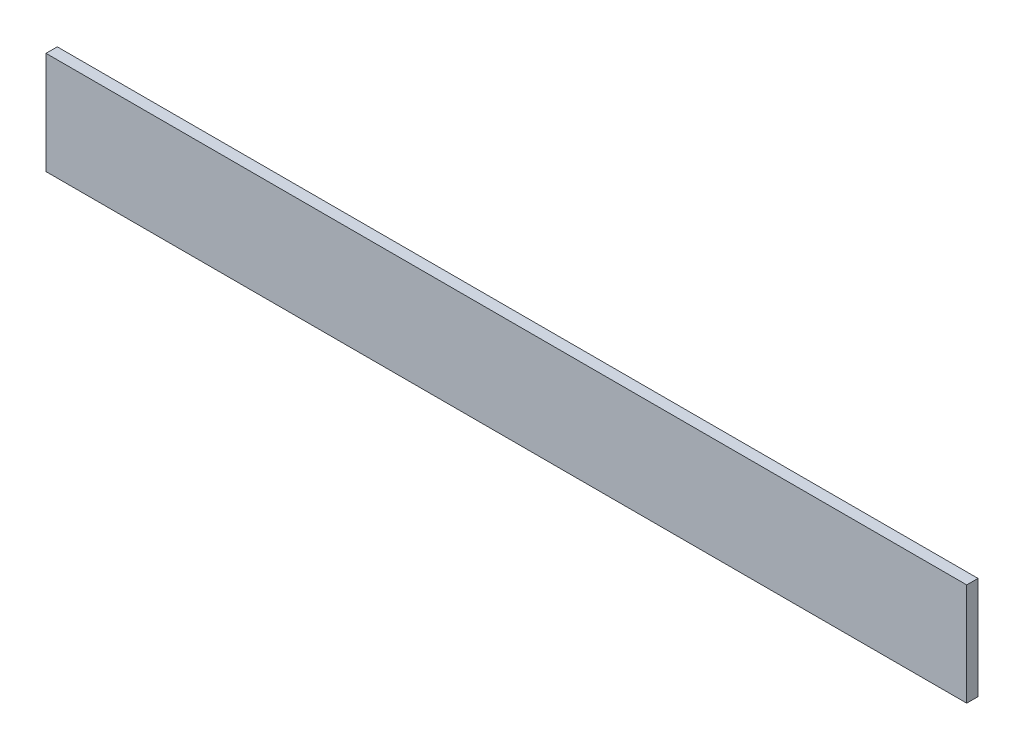
ISO-10303-21;
HEADER;
FILE_DESCRIPTION(('STEP AP214'),'2;1');
FILE_NAME('part.step','',(''),(''),'','','');
FILE_SCHEMA(('AUTOMOTIVE_DESIGN { 1 0 10303 214 1 1 1 1 }'));
ENDSEC;
DATA;
#1=APPLICATION_CONTEXT('core data for automotive mechanical design processes');
#2=APPLICATION_PROTOCOL_DEFINITION('international standard','automotive_design',2000,#1);
#3=PRODUCT_CONTEXT('',#1,'mechanical');
#4=PRODUCT('Part','Part','',(#3));
#5=PRODUCT_RELATED_PRODUCT_CATEGORY('part','',(#4));
#6=PRODUCT_DEFINITION_FORMATION('','',#4);
#7=PRODUCT_DEFINITION_CONTEXT('part definition',#1,'design');
#8=PRODUCT_DEFINITION('design','',#6,#7);
#9=PRODUCT_DEFINITION_SHAPE('','',#8);
#10=(LENGTH_UNIT() NAMED_UNIT(*) SI_UNIT(.MILLI.,.METRE.));
#11=(NAMED_UNIT(*) PLANE_ANGLE_UNIT() SI_UNIT($,.RADIAN.));
#12=(NAMED_UNIT(*) SI_UNIT($,.STERADIAN.) SOLID_ANGLE_UNIT());
#13=UNCERTAINTY_MEASURE_WITH_UNIT(LENGTH_MEASURE(1.E-05),#10,'distance_accuracy_value','');
#14=(GEOMETRIC_REPRESENTATION_CONTEXT(3) GLOBAL_UNCERTAINTY_ASSIGNED_CONTEXT((#13)) GLOBAL_UNIT_ASSIGNED_CONTEXT((#10,
#11,#12)) REPRESENTATION_CONTEXT('',''));
#15=CARTESIAN_POINT('',(0.,0.,0.));
#16=DIRECTION('',(0.,0.,1.));
#17=DIRECTION('',(1.,0.,0.));
#18=AXIS2_PLACEMENT_3D('',#15,#16,#17);
#19=CARTESIAN_POINT('',(0.,0.,1.016));
#20=DIRECTION('',(0.,1.,0.));
#21=DIRECTION('',(0.,0.,1.));
#22=AXIS2_PLACEMENT_3D('',#19,#20,#21);
#23=PLANE('',#22);
#24=DIRECTION('',(1.,0.,0.));
#25=VECTOR('',#24,1.);
#26=CARTESIAN_POINT('',(0.,0.,0.));
#27=LINE('',#26,#25);
#28=CARTESIAN_POINT('',(0.,0.,0.));
#29=VERTEX_POINT('',#28);
#30=CARTESIAN_POINT('',(82.95,0.,0.));
#31=VERTEX_POINT('',#30);
#32=EDGE_CURVE('E96',#29,#31,#27,.T.);
#33=ORIENTED_EDGE('',*,*,#32,.T.);
#34=DIRECTION('',(0.,0.,-1.));
#35=VECTOR('',#34,1.);
#36=CARTESIAN_POINT('',(82.95,0.,1.016));
#37=LINE('',#36,#35);
#38=CARTESIAN_POINT('',(82.95,0.,1.016));
#39=VERTEX_POINT('',#38);
#40=EDGE_CURVE('E11',#39,#31,#37,.T.);
#41=ORIENTED_EDGE('',*,*,#40,.F.);
#42=DIRECTION('',(1.,0.,0.));
#43=VECTOR('',#42,1.);
#44=CARTESIAN_POINT('',(0.,0.,1.016));
#45=LINE('',#44,#43);
#46=CARTESIAN_POINT('',(0.,0.,1.016));
#47=VERTEX_POINT('',#46);
#48=EDGE_CURVE('E84',#47,#39,#45,.T.);
#49=ORIENTED_EDGE('',*,*,#48,.F.);
#50=DIRECTION('',(0.,0.,-1.));
#51=VECTOR('',#50,1.);
#52=CARTESIAN_POINT('',(0.,0.,1.016));
#53=LINE('',#52,#51);
#54=EDGE_CURVE('E92',#47,#29,#53,.T.);
#55=ORIENTED_EDGE('',*,*,#54,.T.);
#56=EDGE_LOOP('',(#33,#41,#49,#55));
#57=FACE_BOUND('',#56,.T.);
#58=ADVANCED_FACE('F33',(#57),#23,.F.);
#59=CARTESIAN_POINT('',(82.95,0.,1.016));
#60=DIRECTION('',(-1.,0.,0.));
#61=DIRECTION('',(0.,-1.,0.));
#62=AXIS2_PLACEMENT_3D('',#59,#60,#61);
#63=PLANE('',#62);
#64=DIRECTION('',(0.,1.,0.));
#65=VECTOR('',#64,1.);
#66=CARTESIAN_POINT('',(82.95,0.,0.));
#67=LINE('',#66,#65);
#68=CARTESIAN_POINT('',(82.95,9.23,0.));
#69=VERTEX_POINT('',#68);
#70=EDGE_CURVE('E88',#31,#69,#67,.T.);
#71=ORIENTED_EDGE('',*,*,#70,.T.);
#72=DIRECTION('',(0.,0.,-1.));
#73=VECTOR('',#72,1.);
#74=CARTESIAN_POINT('',(82.95,9.23,1.016));
#75=LINE('',#74,#73);
#76=CARTESIAN_POINT('',(82.95,9.23,1.016));
#77=VERTEX_POINT('',#76);
#78=EDGE_CURVE('E41',#77,#69,#75,.T.);
#79=ORIENTED_EDGE('',*,*,#78,.F.);
#80=DIRECTION('',(0.,1.,0.));
#81=VECTOR('',#80,1.);
#82=CARTESIAN_POINT('',(82.95,0.,1.016));
#83=LINE('',#82,#81);
#84=EDGE_CURVE('E79',#39,#77,#83,.T.);
#85=ORIENTED_EDGE('',*,*,#84,.F.);
#86=ORIENTED_EDGE('',*,*,#40,.T.);
#87=EDGE_LOOP('',(#71,#79,#85,#86));
#88=FACE_BOUND('',#87,.T.);
#89=ADVANCED_FACE('F87',(#88),#63,.F.);
#90=CARTESIAN_POINT('',(0.,9.23,1.016));
#91=DIRECTION('',(0.,-1.,0.));
#92=DIRECTION('',(0.,0.,-1.));
#93=AXIS2_PLACEMENT_3D('',#90,#91,#92);
#94=PLANE('',#93);
#95=DIRECTION('',(-1.,0.,0.));
#96=VECTOR('',#95,1.);
#97=CARTESIAN_POINT('',(0.,9.23,0.));
#98=LINE('',#97,#96);
#99=CARTESIAN_POINT('',(0.,9.23,0.));
#100=VERTEX_POINT('',#99);
#101=EDGE_CURVE('E66',#69,#100,#98,.T.);
#102=ORIENTED_EDGE('',*,*,#101,.T.);
#103=DIRECTION('',(0.,0.,-1.));
#104=VECTOR('',#103,1.);
#105=CARTESIAN_POINT('',(0.,9.23,1.016));
#106=LINE('',#105,#104);
#107=CARTESIAN_POINT('',(0.,9.23,1.016));
#108=VERTEX_POINT('',#107);
#109=EDGE_CURVE('E89',#108,#100,#106,.T.);
#110=ORIENTED_EDGE('',*,*,#109,.F.);
#111=DIRECTION('',(-1.,0.,0.));
#112=VECTOR('',#111,1.);
#113=CARTESIAN_POINT('',(0.,9.23,1.016));
#114=LINE('',#113,#112);
#115=EDGE_CURVE('E82',#77,#108,#114,.T.);
#116=ORIENTED_EDGE('',*,*,#115,.F.);
#117=ORIENTED_EDGE('',*,*,#78,.T.);
#118=EDGE_LOOP('',(#102,#110,#116,#117));
#119=FACE_BOUND('',#118,.T.);
#120=ADVANCED_FACE('F90',(#119),#94,.F.);
#121=CARTESIAN_POINT('',(0.,0.,1.016));
#122=DIRECTION('',(1.,0.,0.));
#123=DIRECTION('',(0.,0.,-1.));
#124=AXIS2_PLACEMENT_3D('',#121,#122,#123);
#125=PLANE('',#124);
#126=DIRECTION('',(0.,-1.,0.));
#127=VECTOR('',#126,1.);
#128=CARTESIAN_POINT('',(0.,0.,0.));
#129=LINE('',#128,#127);
#130=EDGE_CURVE('E72',#100,#29,#129,.T.);
#131=ORIENTED_EDGE('',*,*,#130,.T.);
#132=ORIENTED_EDGE('',*,*,#54,.F.);
#133=DIRECTION('',(0.,-1.,0.));
#134=VECTOR('',#133,1.);
#135=CARTESIAN_POINT('',(0.,0.,1.016));
#136=LINE('',#135,#134);
#137=EDGE_CURVE('E49',#108,#47,#136,.T.);
#138=ORIENTED_EDGE('',*,*,#137,.F.);
#139=ORIENTED_EDGE('',*,*,#109,.T.);
#140=EDGE_LOOP('',(#131,#132,#138,#139));
#141=FACE_BOUND('',#140,.T.);
#142=ADVANCED_FACE('F103',(#141),#125,.F.);
#143=CARTESIAN_POINT('',(82.95,0.,1.016));
#144=DIRECTION('',(0.,0.,1.));
#145=DIRECTION('',(1.,0.,0.));
#146=AXIS2_PLACEMENT_3D('',#143,#144,#145);
#147=PLANE('',#146);
#148=ORIENTED_EDGE('',*,*,#48,.T.);
#149=ORIENTED_EDGE('',*,*,#84,.T.);
#150=ORIENTED_EDGE('',*,*,#115,.T.);
#151=ORIENTED_EDGE('',*,*,#137,.T.);
#152=EDGE_LOOP('',(#148,#149,#150,#151));
#153=FACE_BOUND('',#152,.T.);
#154=ADVANCED_FACE('F80',(#153),#147,.T.);
#155=CARTESIAN_POINT('',(82.95,0.,0.));
#156=DIRECTION('',(0.,0.,1.));
#157=DIRECTION('',(1.,0.,0.));
#158=AXIS2_PLACEMENT_3D('',#155,#156,#157);
#159=PLANE('',#158);
#160=ORIENTED_EDGE('',*,*,#32,.F.);
#161=ORIENTED_EDGE('',*,*,#130,.F.);
#162=ORIENTED_EDGE('',*,*,#101,.F.);
#163=ORIENTED_EDGE('',*,*,#70,.F.);
#164=EDGE_LOOP('',(#160,#161,#162,#163));
#165=FACE_BOUND('',#164,.T.);
#166=ADVANCED_FACE('F106',(#165),#159,.F.);
#167=CLOSED_SHELL('',(#58,#89,#120,#142,#154,#166));
#168=MANIFOLD_SOLID_BREP('B2',#167);
#169=ADVANCED_BREP_SHAPE_REPRESENTATION('',(#18,#168),#14);
#170=SHAPE_DEFINITION_REPRESENTATION(#9,#169);
ENDSEC;
END-ISO-10303-21;
